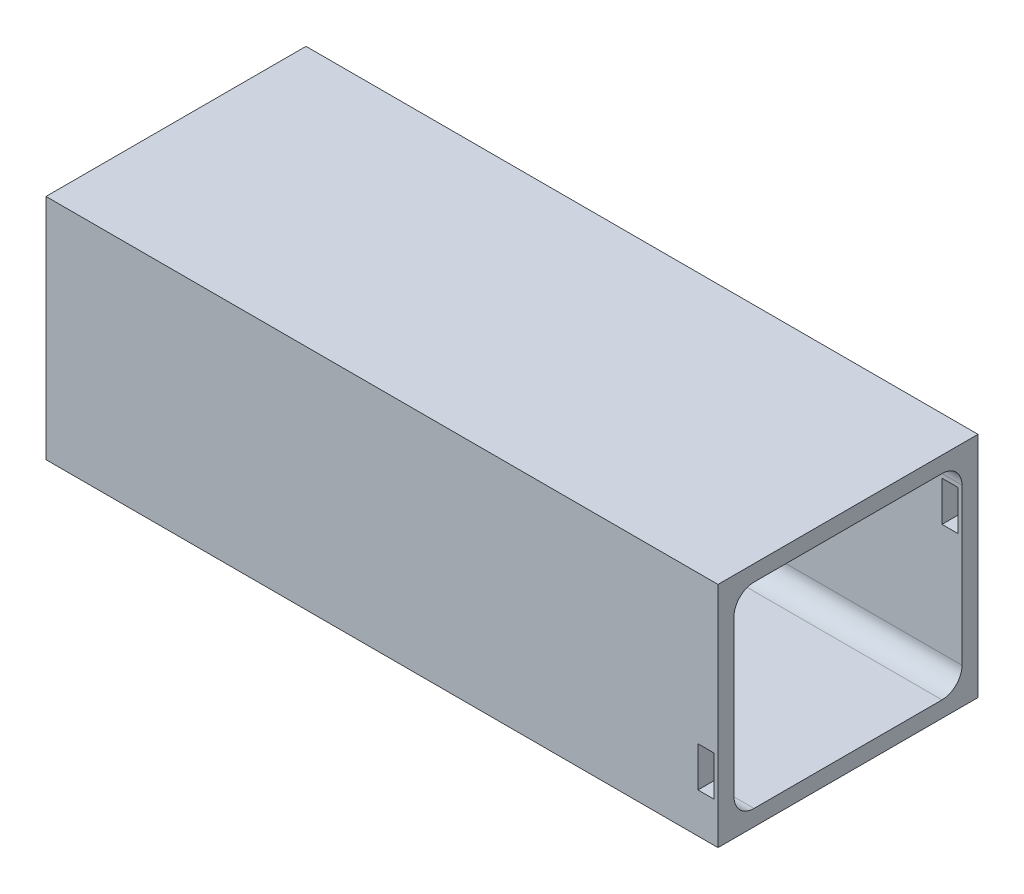
ISO-10303-21;
HEADER;
FILE_DESCRIPTION(('STEP AP214'),'2;1');
FILE_NAME('part.step','',(''),(''),'','','');
FILE_SCHEMA(('AUTOMOTIVE_DESIGN { 1 0 10303 214 1 1 1 1 }'));
ENDSEC;
DATA;
#1=APPLICATION_CONTEXT('core data for automotive mechanical design processes');
#2=APPLICATION_PROTOCOL_DEFINITION('international standard','automotive_design',2000,#1);
#3=PRODUCT_CONTEXT('',#1,'mechanical');
#4=PRODUCT('Part','Part','',(#3));
#5=PRODUCT_RELATED_PRODUCT_CATEGORY('part','',(#4));
#6=PRODUCT_DEFINITION_FORMATION('','',#4);
#7=PRODUCT_DEFINITION_CONTEXT('part definition',#1,'design');
#8=PRODUCT_DEFINITION('design','',#6,#7);
#9=PRODUCT_DEFINITION_SHAPE('','',#8);
#10=(LENGTH_UNIT() NAMED_UNIT(*) SI_UNIT(.MILLI.,.METRE.));
#11=(NAMED_UNIT(*) PLANE_ANGLE_UNIT() SI_UNIT($,.RADIAN.));
#12=(NAMED_UNIT(*) SI_UNIT($,.STERADIAN.) SOLID_ANGLE_UNIT());
#13=UNCERTAINTY_MEASURE_WITH_UNIT(LENGTH_MEASURE(1.E-05),#10,'distance_accuracy_value','');
#14=(GEOMETRIC_REPRESENTATION_CONTEXT(3) GLOBAL_UNCERTAINTY_ASSIGNED_CONTEXT((#13)) GLOBAL_UNIT_ASSIGNED_CONTEXT((#10,
#11,#12)) REPRESENTATION_CONTEXT('',''));
#15=CARTESIAN_POINT('',(0.,0.,0.));
#16=DIRECTION('',(0.,0.,1.));
#17=DIRECTION('',(1.,0.,0.));
#18=AXIS2_PLACEMENT_3D('',#15,#16,#17);
#19=CARTESIAN_POINT('',(-167.,-28.5,32.5));
#20=DIRECTION('',(0.,0.,1.));
#21=DIRECTION('',(1.,0.,0.));
#22=AXIS2_PLACEMENT_3D('',#19,#20,#21);
#23=PLANE('',#22);
#24=DIRECTION('',(0.,1.,0.));
#25=VECTOR('',#24,1.);
#26=CARTESIAN_POINT('',(-1.,-18.5,32.5));
#27=LINE('',#26,#25);
#28=CARTESIAN_POINT('',(-1.,-18.5,32.5));
#29=VERTEX_POINT('',#28);
#30=CARTESIAN_POINT('',(-1.,-8.49999999999999,32.5));
#31=VERTEX_POINT('',#30);
#32=EDGE_CURVE('E227',#29,#31,#27,.T.);
#33=ORIENTED_EDGE('',*,*,#32,.F.);
#34=DIRECTION('',(1.,0.,0.));
#35=VECTOR('',#34,1.);
#36=CARTESIAN_POINT('',(-1.,-18.5,32.5));
#37=LINE('',#36,#35);
#38=CARTESIAN_POINT('',(-5.,-18.5,32.5));
#39=VERTEX_POINT('',#38);
#40=EDGE_CURVE('E238',#39,#29,#37,.T.);
#41=ORIENTED_EDGE('',*,*,#40,.F.);
#42=DIRECTION('',(0.,-1.,0.));
#43=VECTOR('',#42,1.);
#44=CARTESIAN_POINT('',(-5.,-18.5,32.5));
#45=LINE('',#44,#43);
#46=CARTESIAN_POINT('',(-5.,-8.49999999999999,32.5));
#47=VERTEX_POINT('',#46);
#48=EDGE_CURVE('E234',#47,#39,#45,.T.);
#49=ORIENTED_EDGE('',*,*,#48,.F.);
#50=DIRECTION('',(-1.,0.,0.));
#51=VECTOR('',#50,1.);
#52=CARTESIAN_POINT('',(-1.,-8.49999999999999,32.5));
#53=LINE('',#52,#51);
#54=EDGE_CURVE('E230',#31,#47,#53,.T.);
#55=ORIENTED_EDGE('',*,*,#54,.F.);
#56=EDGE_LOOP('',(#33,#41,#49,#55));
#57=FACE_BOUND('',#56,.T.);
#58=DIRECTION('',(0.,-1.,0.));
#59=VECTOR('',#58,1.);
#60=CARTESIAN_POINT('',(0.,-28.5,32.5));
#61=LINE('',#60,#59);
#62=CARTESIAN_POINT('',(0.,28.5,32.5));
#63=VERTEX_POINT('',#62);
#64=CARTESIAN_POINT('',(0.,-28.5,32.5));
#65=VERTEX_POINT('',#64);
#66=EDGE_CURVE('E322',#63,#65,#61,.T.);
#67=ORIENTED_EDGE('',*,*,#66,.F.);
#68=DIRECTION('',(1.,0.,0.));
#69=VECTOR('',#68,1.);
#70=CARTESIAN_POINT('',(-167.,28.5,32.5));
#71=LINE('',#70,#69);
#72=CARTESIAN_POINT('',(-168.,28.5,32.5));
#73=VERTEX_POINT('',#72);
#74=EDGE_CURVE('E360',#73,#63,#71,.T.);
#75=ORIENTED_EDGE('',*,*,#74,.F.);
#76=DIRECTION('',(0.,1.,0.));
#77=VECTOR('',#76,1.);
#78=CARTESIAN_POINT('',(-168.,-28.5,32.5));
#79=LINE('',#78,#77);
#80=CARTESIAN_POINT('',(-168.,-28.5,32.5));
#81=VERTEX_POINT('',#80);
#82=EDGE_CURVE('E219',#81,#73,#79,.T.);
#83=ORIENTED_EDGE('',*,*,#82,.F.);
#84=DIRECTION('',(1.,0.,0.));
#85=VECTOR('',#84,1.);
#86=CARTESIAN_POINT('',(-167.,-28.5,32.5));
#87=LINE('',#86,#85);
#88=EDGE_CURVE('E359',#81,#65,#87,.T.);
#89=ORIENTED_EDGE('',*,*,#88,.T.);
#90=EDGE_LOOP('',(#67,#75,#83,#89));
#91=FACE_BOUND('',#90,.T.);
#92=ADVANCED_FACE('F39',(#57,#91),#23,.T.);
#93=CARTESIAN_POINT('',(-167.,28.5,-32.5));
#94=DIRECTION('',(0.,1.,0.));
#95=DIRECTION('',(0.,0.,1.));
#96=AXIS2_PLACEMENT_3D('',#93,#94,#95);
#97=PLANE('',#96);
#98=DIRECTION('',(0.,0.,1.));
#99=VECTOR('',#98,1.);
#100=CARTESIAN_POINT('',(0.,28.5,-32.5));
#101=LINE('',#100,#99);
#102=CARTESIAN_POINT('',(0.,28.5,-32.5));
#103=VERTEX_POINT('',#102);
#104=EDGE_CURVE('E355',#103,#63,#101,.T.);
#105=ORIENTED_EDGE('',*,*,#104,.F.);
#106=DIRECTION('',(1.,0.,0.));
#107=VECTOR('',#106,1.);
#108=CARTESIAN_POINT('',(-167.,28.5,-32.5));
#109=LINE('',#108,#107);
#110=CARTESIAN_POINT('',(-168.,28.5,-32.5));
#111=VERTEX_POINT('',#110);
#112=EDGE_CURVE('E364',#111,#103,#109,.T.);
#113=ORIENTED_EDGE('',*,*,#112,.F.);
#114=DIRECTION('',(0.,0.,-1.));
#115=VECTOR('',#114,1.);
#116=CARTESIAN_POINT('',(-168.,28.5,32.5));
#117=LINE('',#116,#115);
#118=EDGE_CURVE('E223',#73,#111,#117,.T.);
#119=ORIENTED_EDGE('',*,*,#118,.F.);
#120=ORIENTED_EDGE('',*,*,#74,.T.);
#121=EDGE_LOOP('',(#105,#113,#119,#120));
#122=FACE_BOUND('',#121,.T.);
#123=ADVANCED_FACE('F413',(#122),#97,.T.);
#124=CARTESIAN_POINT('',(-167.,-28.5,-32.5));
#125=DIRECTION('',(0.,0.,-1.));
#126=DIRECTION('',(-1.,0.,0.));
#127=AXIS2_PLACEMENT_3D('',#124,#125,#126);
#128=PLANE('',#127);
#129=DIRECTION('',(0.,-1.,0.));
#130=VECTOR('',#129,1.);
#131=CARTESIAN_POINT('',(-1.,18.5,-32.5));
#132=LINE('',#131,#130);
#133=CARTESIAN_POINT('',(-1.,18.5,-32.5));
#134=VERTEX_POINT('',#133);
#135=CARTESIAN_POINT('',(-1.,8.49999999999999,-32.5));
#136=VERTEX_POINT('',#135);
#137=EDGE_CURVE('E54',#134,#136,#132,.T.);
#138=ORIENTED_EDGE('',*,*,#137,.F.);
#139=DIRECTION('',(1.,0.,0.));
#140=VECTOR('',#139,1.);
#141=CARTESIAN_POINT('',(-1.,18.5,-32.5));
#142=LINE('',#141,#140);
#143=CARTESIAN_POINT('',(-5.,18.5,-32.5));
#144=VERTEX_POINT('',#143);
#145=EDGE_CURVE('E197',#144,#134,#142,.T.);
#146=ORIENTED_EDGE('',*,*,#145,.F.);
#147=DIRECTION('',(0.,1.,0.));
#148=VECTOR('',#147,1.);
#149=CARTESIAN_POINT('',(-5.,18.5,-32.5));
#150=LINE('',#149,#148);
#151=CARTESIAN_POINT('',(-5.,8.49999999999999,-32.5));
#152=VERTEX_POINT('',#151);
#153=EDGE_CURVE('E179',#152,#144,#150,.T.);
#154=ORIENTED_EDGE('',*,*,#153,.F.);
#155=DIRECTION('',(-1.,0.,0.));
#156=VECTOR('',#155,1.);
#157=CARTESIAN_POINT('',(-1.,8.49999999999999,-32.5));
#158=LINE('',#157,#156);
#159=EDGE_CURVE('E189',#136,#152,#158,.T.);
#160=ORIENTED_EDGE('',*,*,#159,.F.);
#161=EDGE_LOOP('',(#138,#146,#154,#160));
#162=FACE_BOUND('',#161,.T.);
#163=DIRECTION('',(0.,1.,0.));
#164=VECTOR('',#163,1.);
#165=CARTESIAN_POINT('',(0.,-28.5,-32.5));
#166=LINE('',#165,#164);
#167=CARTESIAN_POINT('',(0.,-28.5,-32.5));
#168=VERTEX_POINT('',#167);
#169=EDGE_CURVE('E351',#168,#103,#166,.T.);
#170=ORIENTED_EDGE('',*,*,#169,.F.);
#171=DIRECTION('',(1.,0.,0.));
#172=VECTOR('',#171,1.);
#173=CARTESIAN_POINT('',(-167.,-28.5,-32.5));
#174=LINE('',#173,#172);
#175=CARTESIAN_POINT('',(-168.,-28.5,-32.5));
#176=VERTEX_POINT('',#175);
#177=EDGE_CURVE('E367',#176,#168,#174,.T.);
#178=ORIENTED_EDGE('',*,*,#177,.F.);
#179=DIRECTION('',(0.,-1.,0.));
#180=VECTOR('',#179,1.);
#181=CARTESIAN_POINT('',(-168.,-28.5,-32.5));
#182=LINE('',#181,#180);
#183=EDGE_CURVE('E207',#111,#176,#182,.T.);
#184=ORIENTED_EDGE('',*,*,#183,.F.);
#185=ORIENTED_EDGE('',*,*,#112,.T.);
#186=EDGE_LOOP('',(#170,#178,#184,#185));
#187=FACE_BOUND('',#186,.T.);
#188=ADVANCED_FACE('F194',(#162,#187),#128,.T.);
#189=CARTESIAN_POINT('',(-167.,-28.5,-32.5));
#190=DIRECTION('',(0.,-1.,0.));
#191=DIRECTION('',(0.,0.,-1.));
#192=AXIS2_PLACEMENT_3D('',#189,#190,#191);
#193=PLANE('',#192);
#194=DIRECTION('',(0.,0.,-1.));
#195=VECTOR('',#194,1.);
#196=CARTESIAN_POINT('',(0.,-28.5,-32.5));
#197=LINE('',#196,#195);
#198=EDGE_CURVE('E347',#65,#168,#197,.T.);
#199=ORIENTED_EDGE('',*,*,#198,.F.);
#200=ORIENTED_EDGE('',*,*,#88,.F.);
#201=DIRECTION('',(0.,0.,1.));
#202=VECTOR('',#201,1.);
#203=CARTESIAN_POINT('',(-168.,-28.5,32.5));
#204=LINE('',#203,#202);
#205=EDGE_CURVE('E215',#176,#81,#204,.T.);
#206=ORIENTED_EDGE('',*,*,#205,.F.);
#207=ORIENTED_EDGE('',*,*,#177,.T.);
#208=EDGE_LOOP('',(#199,#200,#206,#207));
#209=FACE_BOUND('',#208,.T.);
#210=ADVANCED_FACE('F435',(#209),#193,.T.);
#211=CARTESIAN_POINT('',(0.,0.,0.));
#212=DIRECTION('',(1.,0.,0.));
#213=DIRECTION('',(0.,0.,-1.));
#214=AXIS2_PLACEMENT_3D('',#211,#212,#213);
#215=PLANE('',#214);
#216=CARTESIAN_POINT('',(0.,-19.5,23.5));
#217=DIRECTION('',(1.,0.,0.));
#218=DIRECTION('',(0.,0.,1.));
#219=AXIS2_PLACEMENT_3D('',#216,#217,#218);
#220=CIRCLE('',#219,5.);
#221=CARTESIAN_POINT('',(0.,-19.5,28.5));
#222=VERTEX_POINT('',#221);
#223=CARTESIAN_POINT('',(0.,-24.5,23.5));
#224=VERTEX_POINT('',#223);
#225=EDGE_CURVE('E246',#222,#224,#220,.T.);
#226=ORIENTED_EDGE('',*,*,#225,.F.);
#227=DIRECTION('',(0.,-1.,0.));
#228=VECTOR('',#227,1.);
#229=CARTESIAN_POINT('',(0.,-19.5,28.5));
#230=LINE('',#229,#228);
#231=CARTESIAN_POINT('',(0.,19.5,28.5));
#232=VERTEX_POINT('',#231);
#233=EDGE_CURVE('E261',#232,#222,#230,.T.);
#234=ORIENTED_EDGE('',*,*,#233,.F.);
#235=CARTESIAN_POINT('',(0.,19.5,23.5));
#236=DIRECTION('',(1.,0.,0.));
#237=DIRECTION('',(0.,0.,-1.));
#238=AXIS2_PLACEMENT_3D('',#235,#236,#237);
#239=CIRCLE('',#238,5.);
#240=CARTESIAN_POINT('',(0.,24.5,23.5));
#241=VERTEX_POINT('',#240);
#242=EDGE_CURVE('E312',#241,#232,#239,.T.);
#243=ORIENTED_EDGE('',*,*,#242,.F.);
#244=DIRECTION('',(0.,0.,1.));
#245=VECTOR('',#244,1.);
#246=CARTESIAN_POINT('',(0.,24.5,-23.5));
#247=LINE('',#246,#245);
#248=CARTESIAN_POINT('',(0.,24.5,-23.5));
#249=VERTEX_POINT('',#248);
#250=EDGE_CURVE('E308',#249,#241,#247,.T.);
#251=ORIENTED_EDGE('',*,*,#250,.F.);
#252=CARTESIAN_POINT('',(0.,19.5,-23.5));
#253=DIRECTION('',(1.,0.,0.));
#254=DIRECTION('',(0.,0.,-1.));
#255=AXIS2_PLACEMENT_3D('',#252,#253,#254);
#256=CIRCLE('',#255,5.);
#257=CARTESIAN_POINT('',(0.,19.5,-28.5));
#258=VERTEX_POINT('',#257);
#259=EDGE_CURVE('E304',#258,#249,#256,.T.);
#260=ORIENTED_EDGE('',*,*,#259,.F.);
#261=DIRECTION('',(0.,1.,0.));
#262=VECTOR('',#261,1.);
#263=CARTESIAN_POINT('',(0.,-19.5,-28.5));
#264=LINE('',#263,#262);
#265=CARTESIAN_POINT('',(0.,-19.5,-28.5));
#266=VERTEX_POINT('',#265);
#267=EDGE_CURVE('E300',#266,#258,#264,.T.);
#268=ORIENTED_EDGE('',*,*,#267,.F.);
#269=CARTESIAN_POINT('',(0.,-19.5,-23.5));
#270=DIRECTION('',(1.,0.,0.));
#271=DIRECTION('',(0.,0.,-1.));
#272=AXIS2_PLACEMENT_3D('',#269,#270,#271);
#273=CIRCLE('',#272,5.);
#274=CARTESIAN_POINT('',(0.,-24.5,-23.5));
#275=VERTEX_POINT('',#274);
#276=EDGE_CURVE('E296',#275,#266,#273,.T.);
#277=ORIENTED_EDGE('',*,*,#276,.F.);
#278=DIRECTION('',(0.,0.,-1.));
#279=VECTOR('',#278,1.);
#280=CARTESIAN_POINT('',(0.,-24.5,-23.5));
#281=LINE('',#280,#279);
#282=EDGE_CURVE('E292',#224,#275,#281,.T.);
#283=ORIENTED_EDGE('',*,*,#282,.F.);
#284=EDGE_LOOP('',(#226,#234,#243,#251,#260,#268,#277,#283));
#285=FACE_BOUND('',#284,.T.);
#286=ORIENTED_EDGE('',*,*,#66,.T.);
#287=ORIENTED_EDGE('',*,*,#198,.T.);
#288=ORIENTED_EDGE('',*,*,#169,.T.);
#289=ORIENTED_EDGE('',*,*,#104,.T.);
#290=EDGE_LOOP('',(#286,#287,#288,#289));
#291=FACE_BOUND('',#290,.T.);
#292=ADVANCED_FACE('F429',(#285,#291),#215,.T.);
#293=CARTESIAN_POINT('',(-167.,-19.5,23.5));
#294=DIRECTION('',(1.,0.,0.));
#295=DIRECTION('',(0.,0.,-1.));
#296=AXIS2_PLACEMENT_3D('',#293,#294,#295);
#297=CYLINDRICAL_SURFACE('',#296,5.);
#298=ORIENTED_EDGE('',*,*,#225,.T.);
#299=DIRECTION('',(1.,0.,0.));
#300=VECTOR('',#299,1.);
#301=CARTESIAN_POINT('',(-167.,-24.5,23.5));
#302=LINE('',#301,#300);
#303=CARTESIAN_POINT('',(-167.,-24.5,23.5));
#304=VERTEX_POINT('',#303);
#305=EDGE_CURVE('E289',#304,#224,#302,.T.);
#306=ORIENTED_EDGE('',*,*,#305,.F.);
#307=CARTESIAN_POINT('',(-167.,-19.5,23.5));
#308=DIRECTION('',(1.,0.,0.));
#309=DIRECTION('',(0.,0.,1.));
#310=AXIS2_PLACEMENT_3D('',#307,#308,#309);
#311=CIRCLE('',#310,5.);
#312=CARTESIAN_POINT('',(-167.,-19.5,28.5));
#313=VERTEX_POINT('',#312);
#314=EDGE_CURVE('E256',#313,#304,#311,.T.);
#315=ORIENTED_EDGE('',*,*,#314,.F.);
#316=DIRECTION('',(1.,0.,0.));
#317=VECTOR('',#316,1.);
#318=CARTESIAN_POINT('',(-167.,-19.5,28.5));
#319=LINE('',#318,#317);
#320=EDGE_CURVE('E319',#313,#222,#319,.T.);
#321=ORIENTED_EDGE('',*,*,#320,.T.);
#322=EDGE_LOOP('',(#298,#306,#315,#321));
#323=FACE_BOUND('',#322,.T.);
#324=ADVANCED_FACE('F441',(#323),#297,.F.);
#325=CARTESIAN_POINT('',(-167.,-19.5,28.5));
#326=DIRECTION('',(0.,0.,1.));
#327=DIRECTION('',(1.,0.,0.));
#328=AXIS2_PLACEMENT_3D('',#325,#326,#327);
#329=PLANE('',#328);
#330=DIRECTION('',(1.,0.,0.));
#331=VECTOR('',#330,1.);
#332=CARTESIAN_POINT('',(-167.,-18.5,28.5));
#333=LINE('',#332,#331);
#334=CARTESIAN_POINT('',(-5.,-18.5,28.5));
#335=VERTEX_POINT('',#334);
#336=CARTESIAN_POINT('',(-1.,-18.5,28.5));
#337=VERTEX_POINT('',#336);
#338=EDGE_CURVE('E379',#335,#337,#333,.T.);
#339=ORIENTED_EDGE('',*,*,#338,.T.);
#340=DIRECTION('',(0.,1.,0.));
#341=VECTOR('',#340,1.);
#342=CARTESIAN_POINT('',(-1.,-19.5,28.5));
#343=LINE('',#342,#341);
#344=CARTESIAN_POINT('',(-1.,-8.49999999999999,28.5));
#345=VERTEX_POINT('',#344);
#346=EDGE_CURVE('E383',#337,#345,#343,.T.);
#347=ORIENTED_EDGE('',*,*,#346,.T.);
#348=DIRECTION('',(-1.,0.,0.));
#349=VECTOR('',#348,1.);
#350=CARTESIAN_POINT('',(-167.,-8.49999999999999,28.5));
#351=LINE('',#350,#349);
#352=CARTESIAN_POINT('',(-5.,-8.49999999999999,28.5));
#353=VERTEX_POINT('',#352);
#354=EDGE_CURVE('E363',#345,#353,#351,.T.);
#355=ORIENTED_EDGE('',*,*,#354,.T.);
#356=DIRECTION('',(0.,-1.,0.));
#357=VECTOR('',#356,1.);
#358=CARTESIAN_POINT('',(-5.,-19.5,28.5));
#359=LINE('',#358,#357);
#360=EDGE_CURVE('E375',#353,#335,#359,.T.);
#361=ORIENTED_EDGE('',*,*,#360,.T.);
#362=EDGE_LOOP('',(#339,#347,#355,#361));
#363=FACE_BOUND('',#362,.T.);
#364=ORIENTED_EDGE('',*,*,#233,.T.);
#365=ORIENTED_EDGE('',*,*,#320,.F.);
#366=DIRECTION('',(0.,-1.,0.));
#367=VECTOR('',#366,1.);
#368=CARTESIAN_POINT('',(-167.,-19.5,28.5));
#369=LINE('',#368,#367);
#370=CARTESIAN_POINT('',(-167.,19.5,28.5));
#371=VERTEX_POINT('',#370);
#372=EDGE_CURVE('E285',#371,#313,#369,.T.);
#373=ORIENTED_EDGE('',*,*,#372,.F.);
#374=DIRECTION('',(1.,0.,0.));
#375=VECTOR('',#374,1.);
#376=CARTESIAN_POINT('',(-167.,19.5,28.5));
#377=LINE('',#376,#375);
#378=EDGE_CURVE('E323',#371,#232,#377,.T.);
#379=ORIENTED_EDGE('',*,*,#378,.T.);
#380=EDGE_LOOP('',(#364,#365,#373,#379));
#381=FACE_BOUND('',#380,.T.);
#382=ADVANCED_FACE('F448',(#363,#381),#329,.F.);
#383=CARTESIAN_POINT('',(-167.,19.5,23.5));
#384=DIRECTION('',(1.,0.,0.));
#385=DIRECTION('',(0.,0.,-1.));
#386=AXIS2_PLACEMENT_3D('',#383,#384,#385);
#387=CYLINDRICAL_SURFACE('',#386,5.);
#388=ORIENTED_EDGE('',*,*,#242,.T.);
#389=ORIENTED_EDGE('',*,*,#378,.F.);
#390=CARTESIAN_POINT('',(-167.,19.5,23.5));
#391=DIRECTION('',(1.,0.,0.));
#392=DIRECTION('',(0.,0.,-1.));
#393=AXIS2_PLACEMENT_3D('',#390,#391,#392);
#394=CIRCLE('',#393,5.);
#395=CARTESIAN_POINT('',(-167.,24.5,23.5));
#396=VERTEX_POINT('',#395);
#397=EDGE_CURVE('E281',#396,#371,#394,.T.);
#398=ORIENTED_EDGE('',*,*,#397,.F.);
#399=DIRECTION('',(1.,0.,0.));
#400=VECTOR('',#399,1.);
#401=CARTESIAN_POINT('',(-167.,24.5,23.5));
#402=LINE('',#401,#400);
#403=EDGE_CURVE('E326',#396,#241,#402,.T.);
#404=ORIENTED_EDGE('',*,*,#403,.T.);
#405=EDGE_LOOP('',(#388,#389,#398,#404));
#406=FACE_BOUND('',#405,.T.);
#407=ADVANCED_FACE('F468',(#406),#387,.F.);
#408=CARTESIAN_POINT('',(-167.,24.5,-23.5));
#409=DIRECTION('',(0.,1.,0.));
#410=DIRECTION('',(0.,0.,1.));
#411=AXIS2_PLACEMENT_3D('',#408,#409,#410);
#412=PLANE('',#411);
#413=ORIENTED_EDGE('',*,*,#250,.T.);
#414=ORIENTED_EDGE('',*,*,#403,.F.);
#415=DIRECTION('',(0.,0.,1.));
#416=VECTOR('',#415,1.);
#417=CARTESIAN_POINT('',(-167.,24.5,-23.5));
#418=LINE('',#417,#416);
#419=CARTESIAN_POINT('',(-167.,24.5,-23.5));
#420=VERTEX_POINT('',#419);
#421=EDGE_CURVE('E277',#420,#396,#418,.T.);
#422=ORIENTED_EDGE('',*,*,#421,.F.);
#423=DIRECTION('',(1.,0.,0.));
#424=VECTOR('',#423,1.);
#425=CARTESIAN_POINT('',(-167.,24.5,-23.5));
#426=LINE('',#425,#424);
#427=EDGE_CURVE('E329',#420,#249,#426,.T.);
#428=ORIENTED_EDGE('',*,*,#427,.T.);
#429=EDGE_LOOP('',(#413,#414,#422,#428));
#430=FACE_BOUND('',#429,.T.);
#431=ADVANCED_FACE('F464',(#430),#412,.F.);
#432=CARTESIAN_POINT('',(-167.,19.5,-23.5));
#433=DIRECTION('',(1.,0.,0.));
#434=DIRECTION('',(0.,0.,-1.));
#435=AXIS2_PLACEMENT_3D('',#432,#433,#434);
#436=CYLINDRICAL_SURFACE('',#435,5.);
#437=ORIENTED_EDGE('',*,*,#259,.T.);
#438=ORIENTED_EDGE('',*,*,#427,.F.);
#439=CARTESIAN_POINT('',(-167.,19.5,-23.5));
#440=DIRECTION('',(1.,0.,0.));
#441=DIRECTION('',(0.,0.,-1.));
#442=AXIS2_PLACEMENT_3D('',#439,#440,#441);
#443=CIRCLE('',#442,5.);
#444=CARTESIAN_POINT('',(-167.,19.5,-28.5));
#445=VERTEX_POINT('',#444);
#446=EDGE_CURVE('E273',#445,#420,#443,.T.);
#447=ORIENTED_EDGE('',*,*,#446,.F.);
#448=DIRECTION('',(1.,0.,0.));
#449=VECTOR('',#448,1.);
#450=CARTESIAN_POINT('',(-167.,19.5,-28.5));
#451=LINE('',#450,#449);
#452=EDGE_CURVE('E332',#445,#258,#451,.T.);
#453=ORIENTED_EDGE('',*,*,#452,.T.);
#454=EDGE_LOOP('',(#437,#438,#447,#453));
#455=FACE_BOUND('',#454,.T.);
#456=ADVANCED_FACE('F461',(#455),#436,.F.);
#457=CARTESIAN_POINT('',(-167.,-19.5,-28.5));
#458=DIRECTION('',(0.,0.,-1.));
#459=DIRECTION('',(-1.,0.,0.));
#460=AXIS2_PLACEMENT_3D('',#457,#458,#459);
#461=PLANE('',#460);
#462=DIRECTION('',(1.,0.,0.));
#463=VECTOR('',#462,1.);
#464=CARTESIAN_POINT('',(-167.,18.5,-28.5));
#465=LINE('',#464,#463);
#466=CARTESIAN_POINT('',(-5.,18.5,-28.5));
#467=VERTEX_POINT('',#466);
#468=CARTESIAN_POINT('',(-1.,18.5,-28.5));
#469=VERTEX_POINT('',#468);
#470=EDGE_CURVE('E47',#467,#469,#465,.T.);
#471=ORIENTED_EDGE('',*,*,#470,.T.);
#472=DIRECTION('',(0.,-1.,0.));
#473=VECTOR('',#472,1.);
#474=CARTESIAN_POINT('',(-1.,-19.5,-28.5));
#475=LINE('',#474,#473);
#476=CARTESIAN_POINT('',(-1.,8.49999999999999,-28.5));
#477=VERTEX_POINT('',#476);
#478=EDGE_CURVE('E11',#469,#477,#475,.T.);
#479=ORIENTED_EDGE('',*,*,#478,.T.);
#480=DIRECTION('',(-1.,0.,0.));
#481=VECTOR('',#480,1.);
#482=CARTESIAN_POINT('',(-167.,8.5,-28.5));
#483=LINE('',#482,#481);
#484=CARTESIAN_POINT('',(-5.,8.5,-28.5));
#485=VERTEX_POINT('',#484);
#486=EDGE_CURVE('E387',#477,#485,#483,.T.);
#487=ORIENTED_EDGE('',*,*,#486,.T.);
#488=DIRECTION('',(0.,1.,0.));
#489=VECTOR('',#488,1.);
#490=CARTESIAN_POINT('',(-5.,-19.5,-28.5));
#491=LINE('',#490,#489);
#492=EDGE_CURVE('E182',#485,#467,#491,.T.);
#493=ORIENTED_EDGE('',*,*,#492,.T.);
#494=EDGE_LOOP('',(#471,#479,#487,#493));
#495=FACE_BOUND('',#494,.T.);
#496=ORIENTED_EDGE('',*,*,#267,.T.);
#497=ORIENTED_EDGE('',*,*,#452,.F.);
#498=DIRECTION('',(0.,1.,0.));
#499=VECTOR('',#498,1.);
#500=CARTESIAN_POINT('',(-167.,-19.5,-28.5));
#501=LINE('',#500,#499);
#502=CARTESIAN_POINT('',(-167.,-19.5,-28.5));
#503=VERTEX_POINT('',#502);
#504=EDGE_CURVE('E269',#503,#445,#501,.T.);
#505=ORIENTED_EDGE('',*,*,#504,.F.);
#506=DIRECTION('',(1.,0.,0.));
#507=VECTOR('',#506,1.);
#508=CARTESIAN_POINT('',(-167.,-19.5,-28.5));
#509=LINE('',#508,#507);
#510=EDGE_CURVE('E335',#503,#266,#509,.T.);
#511=ORIENTED_EDGE('',*,*,#510,.T.);
#512=EDGE_LOOP('',(#496,#497,#505,#511));
#513=FACE_BOUND('',#512,.T.);
#514=ADVANCED_FACE('F394',(#495,#513),#461,.F.);
#515=CARTESIAN_POINT('',(-167.,-19.5,-23.5));
#516=DIRECTION('',(1.,0.,0.));
#517=DIRECTION('',(0.,0.,-1.));
#518=AXIS2_PLACEMENT_3D('',#515,#516,#517);
#519=CYLINDRICAL_SURFACE('',#518,5.);
#520=ORIENTED_EDGE('',*,*,#276,.T.);
#521=ORIENTED_EDGE('',*,*,#510,.F.);
#522=CARTESIAN_POINT('',(-167.,-19.5,-23.5));
#523=DIRECTION('',(1.,0.,0.));
#524=DIRECTION('',(0.,0.,-1.));
#525=AXIS2_PLACEMENT_3D('',#522,#523,#524);
#526=CIRCLE('',#525,5.);
#527=CARTESIAN_POINT('',(-167.,-24.5,-23.5));
#528=VERTEX_POINT('',#527);
#529=EDGE_CURVE('E265',#528,#503,#526,.T.);
#530=ORIENTED_EDGE('',*,*,#529,.F.);
#531=DIRECTION('',(1.,0.,0.));
#532=VECTOR('',#531,1.);
#533=CARTESIAN_POINT('',(-167.,-24.5,-23.5));
#534=LINE('',#533,#532);
#535=EDGE_CURVE('E338',#528,#275,#534,.T.);
#536=ORIENTED_EDGE('',*,*,#535,.T.);
#537=EDGE_LOOP('',(#520,#521,#530,#536));
#538=FACE_BOUND('',#537,.T.);
#539=ADVANCED_FACE('F454',(#538),#519,.F.);
#540=CARTESIAN_POINT('',(-167.,-24.5,-23.5));
#541=DIRECTION('',(0.,-1.,0.));
#542=DIRECTION('',(0.,0.,-1.));
#543=AXIS2_PLACEMENT_3D('',#540,#541,#542);
#544=PLANE('',#543);
#545=ORIENTED_EDGE('',*,*,#282,.T.);
#546=ORIENTED_EDGE('',*,*,#535,.F.);
#547=DIRECTION('',(0.,0.,-1.));
#548=VECTOR('',#547,1.);
#549=CARTESIAN_POINT('',(-167.,-24.5,-23.5));
#550=LINE('',#549,#548);
#551=EDGE_CURVE('E260',#304,#528,#550,.T.);
#552=ORIENTED_EDGE('',*,*,#551,.F.);
#553=ORIENTED_EDGE('',*,*,#305,.T.);
#554=EDGE_LOOP('',(#545,#546,#552,#553));
#555=FACE_BOUND('',#554,.T.);
#556=ADVANCED_FACE('F450',(#555),#544,.F.);
#557=CARTESIAN_POINT('',(-1.,-18.5,22.5));
#558=DIRECTION('',(1.,0.,0.));
#559=DIRECTION('',(0.,1.,0.));
#560=AXIS2_PLACEMENT_3D('',#557,#558,#559);
#561=PLANE('',#560);
#562=DIRECTION('',(0.,0.,1.));
#563=VECTOR('',#562,1.);
#564=CARTESIAN_POINT('',(-1.,-18.5,22.5));
#565=LINE('',#564,#563);
#566=EDGE_CURVE('E243',#337,#29,#565,.T.);
#567=ORIENTED_EDGE('',*,*,#566,.T.);
#568=ORIENTED_EDGE('',*,*,#32,.T.);
#569=DIRECTION('',(0.,0.,1.));
#570=VECTOR('',#569,1.);
#571=CARTESIAN_POINT('',(-1.,-8.49999999999999,22.5));
#572=LINE('',#571,#570);
#573=EDGE_CURVE('E242',#345,#31,#572,.T.);
#574=ORIENTED_EDGE('',*,*,#573,.F.);
#575=ORIENTED_EDGE('',*,*,#346,.F.);
#576=EDGE_LOOP('',(#567,#568,#574,#575));
#577=FACE_BOUND('',#576,.T.);
#578=ADVANCED_FACE('F453',(#577),#561,.F.);
#579=CARTESIAN_POINT('',(-1.,-18.5,22.5));
#580=DIRECTION('',(0.,-1.,0.));
#581=DIRECTION('',(0.,0.,-1.));
#582=AXIS2_PLACEMENT_3D('',#579,#580,#581);
#583=PLANE('',#582);
#584=DIRECTION('',(0.,0.,1.));
#585=VECTOR('',#584,1.);
#586=CARTESIAN_POINT('',(-5.,-18.5,22.5));
#587=LINE('',#586,#585);
#588=EDGE_CURVE('E247',#335,#39,#587,.T.);
#589=ORIENTED_EDGE('',*,*,#588,.T.);
#590=ORIENTED_EDGE('',*,*,#40,.T.);
#591=ORIENTED_EDGE('',*,*,#566,.F.);
#592=ORIENTED_EDGE('',*,*,#338,.F.);
#593=EDGE_LOOP('',(#589,#590,#591,#592));
#594=FACE_BOUND('',#593,.T.);
#595=ADVANCED_FACE('F478',(#594),#583,.F.);
#596=CARTESIAN_POINT('',(-5.,-18.5,22.5));
#597=DIRECTION('',(-1.,0.,0.));
#598=DIRECTION('',(0.,0.,1.));
#599=AXIS2_PLACEMENT_3D('',#596,#597,#598);
#600=PLANE('',#599);
#601=DIRECTION('',(0.,0.,1.));
#602=VECTOR('',#601,1.);
#603=CARTESIAN_POINT('',(-5.,-8.49999999999999,22.5));
#604=LINE('',#603,#602);
#605=EDGE_CURVE('E250',#353,#47,#604,.T.);
#606=ORIENTED_EDGE('',*,*,#605,.T.);
#607=ORIENTED_EDGE('',*,*,#48,.T.);
#608=ORIENTED_EDGE('',*,*,#588,.F.);
#609=ORIENTED_EDGE('',*,*,#360,.F.);
#610=EDGE_LOOP('',(#606,#607,#608,#609));
#611=FACE_BOUND('',#610,.T.);
#612=ADVANCED_FACE('F483',(#611),#600,.F.);
#613=CARTESIAN_POINT('',(-1.,-8.49999999999999,22.5));
#614=DIRECTION('',(0.,1.,0.));
#615=DIRECTION('',(0.,0.,1.));
#616=AXIS2_PLACEMENT_3D('',#613,#614,#615);
#617=PLANE('',#616);
#618=ORIENTED_EDGE('',*,*,#573,.T.);
#619=ORIENTED_EDGE('',*,*,#54,.T.);
#620=ORIENTED_EDGE('',*,*,#605,.F.);
#621=ORIENTED_EDGE('',*,*,#354,.F.);
#622=EDGE_LOOP('',(#618,#619,#620,#621));
#623=FACE_BOUND('',#622,.T.);
#624=ADVANCED_FACE('F480',(#623),#617,.F.);
#625=CARTESIAN_POINT('',(-167.,0.,0.));
#626=DIRECTION('',(-1.,0.,0.));
#627=DIRECTION('',(0.,0.,1.));
#628=AXIS2_PLACEMENT_3D('',#625,#626,#627);
#629=PLANE('',#628);
#630=ORIENTED_EDGE('',*,*,#397,.T.);
#631=ORIENTED_EDGE('',*,*,#372,.T.);
#632=ORIENTED_EDGE('',*,*,#314,.T.);
#633=ORIENTED_EDGE('',*,*,#551,.T.);
#634=ORIENTED_EDGE('',*,*,#529,.T.);
#635=ORIENTED_EDGE('',*,*,#504,.T.);
#636=ORIENTED_EDGE('',*,*,#446,.T.);
#637=ORIENTED_EDGE('',*,*,#421,.T.);
#638=EDGE_LOOP('',(#630,#631,#632,#633,#634,#635,#636,#637));
#639=FACE_BOUND('',#638,.T.);
#640=ADVANCED_FACE('F408',(#639),#629,.F.);
#641=CARTESIAN_POINT('',(-168.,0.,0.));
#642=DIRECTION('',(-1.,0.,0.));
#643=DIRECTION('',(0.,0.,1.));
#644=AXIS2_PLACEMENT_3D('',#641,#642,#643);
#645=PLANE('',#644);
#646=ORIENTED_EDGE('',*,*,#183,.T.);
#647=ORIENTED_EDGE('',*,*,#205,.T.);
#648=ORIENTED_EDGE('',*,*,#82,.T.);
#649=ORIENTED_EDGE('',*,*,#118,.T.);
#650=EDGE_LOOP('',(#646,#647,#648,#649));
#651=FACE_BOUND('',#650,.T.);
#652=ADVANCED_FACE('F401',(#651),#645,.T.);
#653=CARTESIAN_POINT('',(-1.,18.5,-22.5));
#654=DIRECTION('',(1.,0.,0.));
#655=DIRECTION('',(0.,1.,0.));
#656=AXIS2_PLACEMENT_3D('',#653,#654,#655);
#657=PLANE('',#656);
#658=DIRECTION('',(0.,0.,-1.));
#659=VECTOR('',#658,1.);
#660=CARTESIAN_POINT('',(-1.,18.5,-22.5));
#661=LINE('',#660,#659);
#662=EDGE_CURVE('E204',#469,#134,#661,.T.);
#663=ORIENTED_EDGE('',*,*,#662,.T.);
#664=ORIENTED_EDGE('',*,*,#137,.T.);
#665=DIRECTION('',(0.,0.,-1.));
#666=VECTOR('',#665,1.);
#667=CARTESIAN_POINT('',(-1.,8.49999999999999,-22.5));
#668=LINE('',#667,#666);
#669=EDGE_CURVE('E186',#477,#136,#668,.T.);
#670=ORIENTED_EDGE('',*,*,#669,.F.);
#671=ORIENTED_EDGE('',*,*,#478,.F.);
#672=EDGE_LOOP('',(#663,#664,#670,#671));
#673=FACE_BOUND('',#672,.T.);
#674=ADVANCED_FACE('F399',(#673),#657,.F.);
#675=CARTESIAN_POINT('',(-1.,18.5,-22.5));
#676=DIRECTION('',(0.,1.,0.));
#677=DIRECTION('',(0.,0.,1.));
#678=AXIS2_PLACEMENT_3D('',#675,#676,#677);
#679=PLANE('',#678);
#680=DIRECTION('',(0.,0.,-1.));
#681=VECTOR('',#680,1.);
#682=CARTESIAN_POINT('',(-5.,18.5,-22.5));
#683=LINE('',#682,#681);
#684=EDGE_CURVE('E185',#467,#144,#683,.T.);
#685=ORIENTED_EDGE('',*,*,#684,.T.);
#686=ORIENTED_EDGE('',*,*,#145,.T.);
#687=ORIENTED_EDGE('',*,*,#662,.F.);
#688=ORIENTED_EDGE('',*,*,#470,.F.);
#689=EDGE_LOOP('',(#685,#686,#687,#688));
#690=FACE_BOUND('',#689,.T.);
#691=ADVANCED_FACE('F398',(#690),#679,.F.);
#692=CARTESIAN_POINT('',(-5.,18.5,-22.5));
#693=DIRECTION('',(-1.,0.,0.));
#694=DIRECTION('',(0.,-1.,0.));
#695=AXIS2_PLACEMENT_3D('',#692,#693,#694);
#696=PLANE('',#695);
#697=DIRECTION('',(0.,0.,-1.));
#698=VECTOR('',#697,1.);
#699=CARTESIAN_POINT('',(-5.,8.49999999999999,-22.5));
#700=LINE('',#699,#698);
#701=EDGE_CURVE('E62',#485,#152,#700,.T.);
#702=ORIENTED_EDGE('',*,*,#701,.T.);
#703=ORIENTED_EDGE('',*,*,#153,.T.);
#704=ORIENTED_EDGE('',*,*,#684,.F.);
#705=ORIENTED_EDGE('',*,*,#492,.F.);
#706=EDGE_LOOP('',(#702,#703,#704,#705));
#707=FACE_BOUND('',#706,.T.);
#708=ADVANCED_FACE('F176',(#707),#696,.F.);
#709=CARTESIAN_POINT('',(-1.,8.49999999999999,-22.5));
#710=DIRECTION('',(0.,-1.,0.));
#711=DIRECTION('',(0.,0.,-1.));
#712=AXIS2_PLACEMENT_3D('',#709,#710,#711);
#713=PLANE('',#712);
#714=ORIENTED_EDGE('',*,*,#669,.T.);
#715=ORIENTED_EDGE('',*,*,#159,.T.);
#716=ORIENTED_EDGE('',*,*,#701,.F.);
#717=ORIENTED_EDGE('',*,*,#486,.F.);
#718=EDGE_LOOP('',(#714,#715,#716,#717));
#719=FACE_BOUND('',#718,.T.);
#720=ADVANCED_FACE('F190',(#719),#713,.F.);
#721=CLOSED_SHELL('',(#92,#123,#188,#210,#292,#324,#382,#407,#431,#456,#514,#539,#556,#578,#595,
#612,#624,#640,#652,#674,#691,#708,#720));
#722=MANIFOLD_SOLID_BREP('B2',#721);
#723=ADVANCED_BREP_SHAPE_REPRESENTATION('',(#18,#722),#14);
#724=SHAPE_DEFINITION_REPRESENTATION(#9,#723);
ENDSEC;
END-ISO-10303-21;
